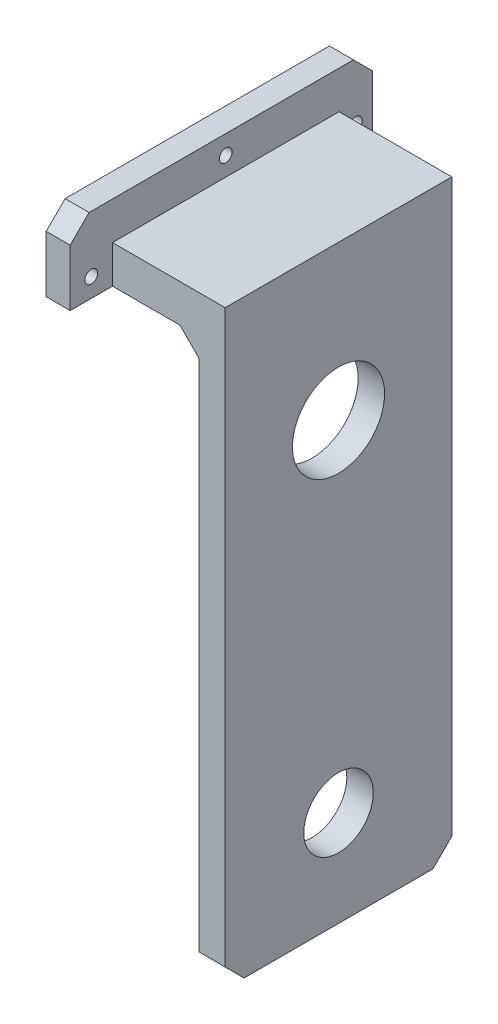
ISO-10303-21;
HEADER;
FILE_DESCRIPTION(('STEP AP214'),'2;1');
FILE_NAME('part.step','',(''),(''),'','','');
FILE_SCHEMA(('AUTOMOTIVE_DESIGN { 1 0 10303 214 1 1 1 1 }'));
ENDSEC;
DATA;
#1=APPLICATION_CONTEXT('core data for automotive mechanical design processes');
#2=APPLICATION_PROTOCOL_DEFINITION('international standard','automotive_design',2000,#1);
#3=PRODUCT_CONTEXT('',#1,'mechanical');
#4=PRODUCT('Part','Part','',(#3));
#5=PRODUCT_RELATED_PRODUCT_CATEGORY('part','',(#4));
#6=PRODUCT_DEFINITION_FORMATION('','',#4);
#7=PRODUCT_DEFINITION_CONTEXT('part definition',#1,'design');
#8=PRODUCT_DEFINITION('design','',#6,#7);
#9=PRODUCT_DEFINITION_SHAPE('','',#8);
#10=(LENGTH_UNIT() NAMED_UNIT(*) SI_UNIT(.MILLI.,.METRE.));
#11=(NAMED_UNIT(*) PLANE_ANGLE_UNIT() SI_UNIT($,.RADIAN.));
#12=(NAMED_UNIT(*) SI_UNIT($,.STERADIAN.) SOLID_ANGLE_UNIT());
#13=UNCERTAINTY_MEASURE_WITH_UNIT(LENGTH_MEASURE(1.E-05),#10,'distance_accuracy_value','');
#14=(GEOMETRIC_REPRESENTATION_CONTEXT(3) GLOBAL_UNCERTAINTY_ASSIGNED_CONTEXT((#13)) GLOBAL_UNIT_ASSIGNED_CONTEXT((#10,
#11,#12)) REPRESENTATION_CONTEXT('',''));
#15=CARTESIAN_POINT('',(0.,0.,0.));
#16=DIRECTION('',(0.,0.,1.));
#17=DIRECTION('',(1.,0.,0.));
#18=AXIS2_PLACEMENT_3D('',#15,#16,#17);
#19=CARTESIAN_POINT('',(18.1,-2.5,15.));
#20=DIRECTION('',(0.,1.,0.));
#21=DIRECTION('',(0.,0.,1.));
#22=AXIS2_PLACEMENT_3D('',#19,#20,#21);
#23=PLANE('',#22);
#24=DIRECTION('',(-1.,0.,0.));
#25=VECTOR('',#24,1.);
#26=CARTESIAN_POINT('',(18.1,-2.5,-15.));
#27=LINE('',#26,#25);
#28=CARTESIAN_POINT('',(12.1,-2.5,-15.));
#29=VERTEX_POINT('',#28);
#30=CARTESIAN_POINT('',(3.175,-2.5,-15.));
#31=VERTEX_POINT('',#30);
#32=EDGE_CURVE('E214',#29,#31,#27,.T.);
#33=ORIENTED_EDGE('',*,*,#32,.F.);
#34=DIRECTION('',(0.,0.,1.));
#35=VECTOR('',#34,1.);
#36=CARTESIAN_POINT('',(12.1,-2.5,15.));
#37=LINE('',#36,#35);
#38=CARTESIAN_POINT('',(12.1,-2.5,15.));
#39=VERTEX_POINT('',#38);
#40=EDGE_CURVE('E223',#29,#39,#37,.T.);
#41=ORIENTED_EDGE('',*,*,#40,.T.);
#42=DIRECTION('',(-1.,0.,0.));
#43=VECTOR('',#42,1.);
#44=CARTESIAN_POINT('',(18.1,-2.5,15.));
#45=LINE('',#44,#43);
#46=CARTESIAN_POINT('',(3.175,-2.5,15.));
#47=VERTEX_POINT('',#46);
#48=EDGE_CURVE('E216',#39,#47,#45,.T.);
#49=ORIENTED_EDGE('',*,*,#48,.T.);
#50=DIRECTION('',(0.,0.,1.));
#51=VECTOR('',#50,1.);
#52=CARTESIAN_POINT('',(3.175,-2.5,-19.402609778092));
#53=LINE('',#52,#51);
#54=CARTESIAN_POINT('',(3.175,-2.5,20.597390221908));
#55=VERTEX_POINT('',#54);
#56=EDGE_CURVE('E162',#47,#55,#53,.T.);
#57=ORIENTED_EDGE('',*,*,#56,.T.);
#58=DIRECTION('',(-1.,0.,0.));
#59=VECTOR('',#58,1.);
#60=CARTESIAN_POINT('',(3.175,-2.5,20.597390221908));
#61=LINE('',#60,#59);
#62=CARTESIAN_POINT('',(0.,-2.5,20.597390221908));
#63=VERTEX_POINT('',#62);
#64=EDGE_CURVE('E172',#55,#63,#61,.T.);
#65=ORIENTED_EDGE('',*,*,#64,.T.);
#66=DIRECTION('',(0.,0.,-1.));
#67=VECTOR('',#66,1.);
#68=CARTESIAN_POINT('',(0.,-2.5,15.));
#69=LINE('',#68,#67);
#70=CARTESIAN_POINT('',(0.,-2.5,-19.402609778092));
#71=VERTEX_POINT('',#70);
#72=EDGE_CURVE('E171',#63,#71,#69,.T.);
#73=ORIENTED_EDGE('',*,*,#72,.T.);
#74=DIRECTION('',(-1.,0.,0.));
#75=VECTOR('',#74,1.);
#76=CARTESIAN_POINT('',(3.175,-2.5,-19.402609778092));
#77=LINE('',#76,#75);
#78=CARTESIAN_POINT('',(3.175,-2.5,-19.402609778092));
#79=VERTEX_POINT('',#78);
#80=EDGE_CURVE('E156',#79,#71,#77,.T.);
#81=ORIENTED_EDGE('',*,*,#80,.F.);
#82=EDGE_CURVE('E169',#79,#31,#53,.T.);
#83=ORIENTED_EDGE('',*,*,#82,.T.);
#84=EDGE_LOOP('',(#33,#41,#49,#57,#65,#73,#81,#83));
#85=FACE_BOUND('',#84,.T.);
#86=ADVANCED_FACE('F44',(#85),#23,.F.);
#87=CARTESIAN_POINT('',(18.1,2.5,15.));
#88=DIRECTION('',(0.,0.,-1.));
#89=DIRECTION('',(-1.,0.,0.));
#90=AXIS2_PLACEMENT_3D('',#87,#88,#89);
#91=PLANE('',#90);
#92=DIRECTION('',(0.,1.,0.));
#93=VECTOR('',#92,1.);
#94=CARTESIAN_POINT('',(14.6,-75.6,15.));
#95=LINE('',#94,#93);
#96=CARTESIAN_POINT('',(14.6,-73.1,15.));
#97=VERTEX_POINT('',#96);
#98=CARTESIAN_POINT('',(14.6,-5.,15.));
#99=VERTEX_POINT('',#98);
#100=EDGE_CURVE('E287',#97,#99,#95,.T.);
#101=ORIENTED_EDGE('',*,*,#100,.F.);
#102=DIRECTION('',(1.,0.,0.));
#103=VECTOR('',#102,1.);
#104=CARTESIAN_POINT('',(18.1,-73.1,15.));
#105=LINE('',#104,#103);
#106=CARTESIAN_POINT('',(18.1,-73.1,15.));
#107=VERTEX_POINT('',#106);
#108=EDGE_CURVE('E11',#97,#107,#105,.T.);
#109=ORIENTED_EDGE('',*,*,#108,.T.);
#110=DIRECTION('',(0.,-1.,0.));
#111=VECTOR('',#110,1.);
#112=CARTESIAN_POINT('',(18.1,2.5,15.));
#113=LINE('',#112,#111);
#114=CARTESIAN_POINT('',(18.1,2.5,15.));
#115=VERTEX_POINT('',#114);
#116=EDGE_CURVE('E200',#115,#107,#113,.T.);
#117=ORIENTED_EDGE('',*,*,#116,.F.);
#118=DIRECTION('',(-1.,0.,0.));
#119=VECTOR('',#118,1.);
#120=CARTESIAN_POINT('',(18.1,2.5,15.));
#121=LINE('',#120,#119);
#122=CARTESIAN_POINT('',(3.175,2.5,15.));
#123=VERTEX_POINT('',#122);
#124=EDGE_CURVE('E207',#115,#123,#121,.T.);
#125=ORIENTED_EDGE('',*,*,#124,.T.);
#126=DIRECTION('',(0.,1.,0.));
#127=VECTOR('',#126,1.);
#128=CARTESIAN_POINT('',(3.175,2.5,15.));
#129=LINE('',#128,#127);
#130=EDGE_CURVE('E197',#47,#123,#129,.T.);
#131=ORIENTED_EDGE('',*,*,#130,.F.);
#132=ORIENTED_EDGE('',*,*,#48,.F.);
#133=DIRECTION('',(-0.707106781186545,0.70710678118655,0.));
#134=VECTOR('',#133,1.);
#135=CARTESIAN_POINT('',(12.6,-2.99999999999998,15.));
#136=LINE('',#135,#134);
#137=EDGE_CURVE('E227',#39,#99,#136,.F.);
#138=ORIENTED_EDGE('',*,*,#137,.T.);
#139=EDGE_LOOP('',(#101,#109,#117,#125,#131,#132,#138));
#140=FACE_BOUND('',#139,.T.);
#141=ADVANCED_FACE('F286',(#140),#91,.F.);
#142=CARTESIAN_POINT('',(18.1,2.5,-15.));
#143=DIRECTION('',(0.,0.,1.));
#144=DIRECTION('',(1.,0.,0.));
#145=AXIS2_PLACEMENT_3D('',#142,#143,#144);
#146=PLANE('',#145);
#147=DIRECTION('',(0.,1.,0.));
#148=VECTOR('',#147,1.);
#149=CARTESIAN_POINT('',(18.1,2.5,-15.));
#150=LINE('',#149,#148);
#151=CARTESIAN_POINT('',(18.1,-73.1,-15.));
#152=VERTEX_POINT('',#151);
#153=CARTESIAN_POINT('',(18.1,2.5,-15.));
#154=VERTEX_POINT('',#153);
#155=EDGE_CURVE('E203',#152,#154,#150,.T.);
#156=ORIENTED_EDGE('',*,*,#155,.F.);
#157=DIRECTION('',(-1.,0.,0.));
#158=VECTOR('',#157,1.);
#159=CARTESIAN_POINT('',(18.1,-73.1,-15.));
#160=LINE('',#159,#158);
#161=CARTESIAN_POINT('',(14.6,-73.1,-15.));
#162=VERTEX_POINT('',#161);
#163=EDGE_CURVE('E68',#152,#162,#160,.T.);
#164=ORIENTED_EDGE('',*,*,#163,.T.);
#165=DIRECTION('',(0.,1.,0.));
#166=VECTOR('',#165,1.);
#167=CARTESIAN_POINT('',(14.6,-75.6,-15.));
#168=LINE('',#167,#166);
#169=CARTESIAN_POINT('',(14.6,-5.,-15.));
#170=VERTEX_POINT('',#169);
#171=EDGE_CURVE('E262',#162,#170,#168,.T.);
#172=ORIENTED_EDGE('',*,*,#171,.T.);
#173=DIRECTION('',(0.707106781186545,-0.70710678118655,0.));
#174=VECTOR('',#173,1.);
#175=CARTESIAN_POINT('',(12.6,-2.99999999999998,-15.));
#176=LINE('',#175,#174);
#177=EDGE_CURVE('E225',#170,#29,#176,.F.);
#178=ORIENTED_EDGE('',*,*,#177,.T.);
#179=ORIENTED_EDGE('',*,*,#32,.T.);
#180=DIRECTION('',(0.,-1.,0.));
#181=VECTOR('',#180,1.);
#182=CARTESIAN_POINT('',(3.175,2.5,-15.));
#183=LINE('',#182,#181);
#184=CARTESIAN_POINT('',(3.175,2.5,-15.));
#185=VERTEX_POINT('',#184);
#186=EDGE_CURVE('E178',#185,#31,#183,.T.);
#187=ORIENTED_EDGE('',*,*,#186,.F.);
#188=DIRECTION('',(-1.,0.,0.));
#189=VECTOR('',#188,1.);
#190=CARTESIAN_POINT('',(18.1,2.5,-15.));
#191=LINE('',#190,#189);
#192=EDGE_CURVE('E211',#154,#185,#191,.T.);
#193=ORIENTED_EDGE('',*,*,#192,.F.);
#194=EDGE_LOOP('',(#156,#164,#172,#178,#179,#187,#193));
#195=FACE_BOUND('',#194,.T.);
#196=ADVANCED_FACE('F276',(#195),#146,.F.);
#197=CARTESIAN_POINT('',(18.1,2.5,15.));
#198=DIRECTION('',(0.,-1.,0.));
#199=DIRECTION('',(0.,0.,-1.));
#200=AXIS2_PLACEMENT_3D('',#197,#198,#199);
#201=PLANE('',#200);
#202=DIRECTION('',(0.,0.,-1.));
#203=VECTOR('',#202,1.);
#204=CARTESIAN_POINT('',(3.175,2.5,15.));
#205=LINE('',#204,#203);
#206=EDGE_CURVE('E218',#123,#185,#205,.T.);
#207=ORIENTED_EDGE('',*,*,#206,.F.);
#208=ORIENTED_EDGE('',*,*,#124,.F.);
#209=DIRECTION('',(0.,0.,1.));
#210=VECTOR('',#209,1.);
#211=CARTESIAN_POINT('',(18.1,2.5,15.));
#212=LINE('',#211,#210);
#213=EDGE_CURVE('E205',#154,#115,#212,.T.);
#214=ORIENTED_EDGE('',*,*,#213,.F.);
#215=ORIENTED_EDGE('',*,*,#192,.T.);
#216=EDGE_LOOP('',(#207,#208,#214,#215));
#217=FACE_BOUND('',#216,.T.);
#218=ADVANCED_FACE('F280',(#217),#201,.F.);
#219=CARTESIAN_POINT('',(18.1,0.,0.));
#220=DIRECTION('',(1.,0.,0.));
#221=DIRECTION('',(0.,0.,-1.));
#222=AXIS2_PLACEMENT_3D('',#219,#220,#221);
#223=PLANE('',#222);
#224=CARTESIAN_POINT('',(18.1,-17.9000000000868,-2.03531101694576E-06));
#225=DIRECTION('',(1.,0.,0.));
#226=DIRECTION('',(0.,0.,-1.));
#227=AXIS2_PLACEMENT_3D('',#224,#225,#226);
#228=CIRCLE('',#227,6.1);
#229=CARTESIAN_POINT('',(18.1,-17.9000000000868,-6.10000203531102));
#230=VERTEX_POINT('',#229);
#231=EDGE_CURVE('E566',#230,#230,#228,.T.);
#232=ORIENTED_EDGE('',*,*,#231,.F.);
#233=EDGE_LOOP('',(#232));
#234=FACE_BOUND('',#233,.T.);
#235=CARTESIAN_POINT('',(18.1,-62.9000000000129,-5.14422879294152E-09));
#236=DIRECTION('',(1.,0.,0.));
#237=DIRECTION('',(0.,0.,-1.));
#238=AXIS2_PLACEMENT_3D('',#235,#236,#237);
#239=CIRCLE('',#238,4.6);
#240=CARTESIAN_POINT('',(18.1,-62.9000000000129,-4.60000000514423));
#241=VERTEX_POINT('',#240);
#242=EDGE_CURVE('E569',#241,#241,#239,.T.);
#243=ORIENTED_EDGE('',*,*,#242,.F.);
#244=EDGE_LOOP('',(#243));
#245=FACE_BOUND('',#244,.T.);
#246=DIRECTION('',(0.,0.,1.));
#247=VECTOR('',#246,1.);
#248=CARTESIAN_POINT('',(18.1,-75.6,15.));
#249=LINE('',#248,#247);
#250=CARTESIAN_POINT('',(18.1,-75.6,-12.5));
#251=VERTEX_POINT('',#250);
#252=CARTESIAN_POINT('',(18.1,-75.6,12.5));
#253=VERTEX_POINT('',#252);
#254=EDGE_CURVE('E270',#251,#253,#249,.T.);
#255=ORIENTED_EDGE('',*,*,#254,.F.);
#256=DIRECTION('',(0.,-0.707106781186548,0.707106781186548));
#257=VECTOR('',#256,1.);
#258=CARTESIAN_POINT('',(18.1,-44.05,-44.05));
#259=LINE('',#258,#257);
#260=EDGE_CURVE('E255',#251,#152,#259,.F.);
#261=ORIENTED_EDGE('',*,*,#260,.T.);
#262=ORIENTED_EDGE('',*,*,#155,.T.);
#263=ORIENTED_EDGE('',*,*,#213,.T.);
#264=ORIENTED_EDGE('',*,*,#116,.T.);
#265=DIRECTION('',(0.,0.707106781186548,0.707106781186548));
#266=VECTOR('',#265,1.);
#267=CARTESIAN_POINT('',(18.1,-44.05,44.05));
#268=LINE('',#267,#266);
#269=EDGE_CURVE('E253',#107,#253,#268,.F.);
#270=ORIENTED_EDGE('',*,*,#269,.T.);
#271=EDGE_LOOP('',(#255,#261,#262,#263,#264,#270));
#272=FACE_BOUND('',#271,.T.);
#273=ADVANCED_FACE('F274',(#234,#245,#272),#223,.T.);
#274=CARTESIAN_POINT('',(0.,0.,0.));
#275=DIRECTION('',(1.,0.,0.));
#276=DIRECTION('',(0.,0.,-1.));
#277=AXIS2_PLACEMENT_3D('',#274,#275,#276);
#278=PLANE('',#277);
#279=DIRECTION('',(0.,0.,-1.));
#280=VECTOR('',#279,1.);
#281=CARTESIAN_POINT('',(0.,7.5,-19.402609778092));
#282=LINE('',#281,#280);
#283=CARTESIAN_POINT('',(0.,7.5,18.097390221908));
#284=VERTEX_POINT('',#283);
#285=CARTESIAN_POINT('',(0.,7.5,-16.902609778092));
#286=VERTEX_POINT('',#285);
#287=EDGE_CURVE('E163',#284,#286,#282,.T.);
#288=ORIENTED_EDGE('',*,*,#287,.T.);
#289=DIRECTION('',(0.,0.707106781186549,0.707106781186546));
#290=VECTOR('',#289,1.);
#291=CARTESIAN_POINT('',(0.,7.5,-16.902609778092));
#292=LINE('',#291,#290);
#293=CARTESIAN_POINT('',(0.,4.99999999999998,-19.402609778092));
#294=VERTEX_POINT('',#293);
#295=EDGE_CURVE('E237',#286,#294,#292,.F.);
#296=ORIENTED_EDGE('',*,*,#295,.T.);
#297=DIRECTION('',(0.,-1.,0.));
#298=VECTOR('',#297,1.);
#299=CARTESIAN_POINT('',(0.,7.5,-19.402609778092));
#300=LINE('',#299,#298);
#301=EDGE_CURVE('E187',#294,#71,#300,.T.);
#302=ORIENTED_EDGE('',*,*,#301,.T.);
#303=ORIENTED_EDGE('',*,*,#72,.F.);
#304=DIRECTION('',(0.,1.,0.));
#305=VECTOR('',#304,1.);
#306=CARTESIAN_POINT('',(0.,-2.5,20.597390221908));
#307=LINE('',#306,#305);
#308=CARTESIAN_POINT('',(0.,5.00000000000001,20.597390221908));
#309=VERTEX_POINT('',#308);
#310=EDGE_CURVE('E189',#63,#309,#307,.T.);
#311=ORIENTED_EDGE('',*,*,#310,.T.);
#312=DIRECTION('',(0.,-0.707106781186548,0.707106781186548));
#313=VECTOR('',#312,1.);
#314=CARTESIAN_POINT('',(0.,5.00000000000001,20.597390221908));
#315=LINE('',#314,#313);
#316=EDGE_CURVE('E235',#309,#284,#315,.F.);
#317=ORIENTED_EDGE('',*,*,#316,.T.);
#318=EDGE_LOOP('',(#288,#296,#302,#303,#311,#317));
#319=FACE_BOUND('',#318,.T.);
#320=CARTESIAN_POINT('',(0.,5.,0.));
#321=DIRECTION('',(-1.,0.,0.));
#322=DIRECTION('',(0.,0.,1.));
#323=AXIS2_PLACEMENT_3D('',#320,#321,#322);
#324=CIRCLE('',#323,0.85);
#325=CARTESIAN_POINT('',(0.,5.,0.85));
#326=VERTEX_POINT('',#325);
#327=EDGE_CURVE('E304',#326,#326,#324,.T.);
#328=ORIENTED_EDGE('',*,*,#327,.F.);
#329=EDGE_LOOP('',(#328));
#330=FACE_BOUND('',#329,.T.);
#331=CARTESIAN_POINT('',(0.,0.,-17.201304889046));
#332=DIRECTION('',(-1.,0.,0.));
#333=DIRECTION('',(0.,0.,1.));
#334=AXIS2_PLACEMENT_3D('',#331,#332,#333);
#335=CIRCLE('',#334,0.85);
#336=CARTESIAN_POINT('',(0.,0.,-16.351304889046));
#337=VERTEX_POINT('',#336);
#338=EDGE_CURVE('E299',#337,#337,#335,.T.);
#339=ORIENTED_EDGE('',*,*,#338,.F.);
#340=EDGE_LOOP('',(#339));
#341=FACE_BOUND('',#340,.T.);
#342=CARTESIAN_POINT('',(0.,0.,17.798695110954));
#343=DIRECTION('',(-1.,0.,0.));
#344=DIRECTION('',(0.,0.,1.));
#345=AXIS2_PLACEMENT_3D('',#342,#343,#344);
#346=CIRCLE('',#345,0.85);
#347=CARTESIAN_POINT('',(0.,0.,18.648695110954));
#348=VERTEX_POINT('',#347);
#349=EDGE_CURVE('E291',#348,#348,#346,.T.);
#350=ORIENTED_EDGE('',*,*,#349,.F.);
#351=EDGE_LOOP('',(#350));
#352=FACE_BOUND('',#351,.T.);
#353=ADVANCED_FACE('F313',(#319,#330,#341,#352),#278,.F.);
#354=CARTESIAN_POINT('',(3.175,0.,0.));
#355=DIRECTION('',(-1.,0.,0.));
#356=DIRECTION('',(0.,0.,1.));
#357=AXIS2_PLACEMENT_3D('',#354,#355,#356);
#358=PLANE('',#357);
#359=CARTESIAN_POINT('',(3.175,0.,17.798695110954));
#360=DIRECTION('',(-1.,0.,0.));
#361=DIRECTION('',(0.,0.,1.));
#362=AXIS2_PLACEMENT_3D('',#359,#360,#361);
#363=CIRCLE('',#362,0.85);
#364=CARTESIAN_POINT('',(3.175,0.,18.648695110954));
#365=VERTEX_POINT('',#364);
#366=EDGE_CURVE('E294',#365,#365,#363,.T.);
#367=ORIENTED_EDGE('',*,*,#366,.T.);
#368=EDGE_LOOP('',(#367));
#369=FACE_BOUND('',#368,.T.);
#370=CARTESIAN_POINT('',(3.175,0.,-17.201304889046));
#371=DIRECTION('',(-1.,0.,0.));
#372=DIRECTION('',(0.,0.,1.));
#373=AXIS2_PLACEMENT_3D('',#370,#371,#372);
#374=CIRCLE('',#373,0.85);
#375=CARTESIAN_POINT('',(3.175,0.,-16.351304889046));
#376=VERTEX_POINT('',#375);
#377=EDGE_CURVE('E301',#376,#376,#374,.T.);
#378=ORIENTED_EDGE('',*,*,#377,.T.);
#379=EDGE_LOOP('',(#378));
#380=FACE_BOUND('',#379,.T.);
#381=CARTESIAN_POINT('',(3.175,5.,0.));
#382=DIRECTION('',(-1.,0.,0.));
#383=DIRECTION('',(0.,0.,1.));
#384=AXIS2_PLACEMENT_3D('',#381,#382,#383);
#385=CIRCLE('',#384,0.85);
#386=CARTESIAN_POINT('',(3.175,5.,0.85));
#387=VERTEX_POINT('',#386);
#388=EDGE_CURVE('E190',#387,#387,#385,.T.);
#389=ORIENTED_EDGE('',*,*,#388,.T.);
#390=EDGE_LOOP('',(#389));
#391=FACE_BOUND('',#390,.T.);
#392=DIRECTION('',(0.,-1.,0.));
#393=VECTOR('',#392,1.);
#394=CARTESIAN_POINT('',(3.175,7.5,-19.402609778092));
#395=LINE('',#394,#393);
#396=CARTESIAN_POINT('',(3.175,4.99999999999998,-19.402609778092));
#397=VERTEX_POINT('',#396);
#398=EDGE_CURVE('E152',#397,#79,#395,.T.);
#399=ORIENTED_EDGE('',*,*,#398,.F.);
#400=DIRECTION('',(0.,-0.707106781186549,-0.707106781186546));
#401=VECTOR('',#400,1.);
#402=CARTESIAN_POINT('',(3.175,7.5,-16.902609778092));
#403=LINE('',#402,#401);
#404=CARTESIAN_POINT('',(3.175,7.5,-16.902609778092));
#405=VERTEX_POINT('',#404);
#406=EDGE_CURVE('E242',#397,#405,#403,.F.);
#407=ORIENTED_EDGE('',*,*,#406,.T.);
#408=DIRECTION('',(0.,0.,-1.));
#409=VECTOR('',#408,1.);
#410=CARTESIAN_POINT('',(3.175,7.5,-19.402609778092));
#411=LINE('',#410,#409);
#412=CARTESIAN_POINT('',(3.175,7.5,18.097390221908));
#413=VERTEX_POINT('',#412);
#414=EDGE_CURVE('E173',#413,#405,#411,.T.);
#415=ORIENTED_EDGE('',*,*,#414,.F.);
#416=DIRECTION('',(0.,0.707106781186548,-0.707106781186548));
#417=VECTOR('',#416,1.);
#418=CARTESIAN_POINT('',(3.175,5.00000000000001,20.597390221908));
#419=LINE('',#418,#417);
#420=CARTESIAN_POINT('',(3.175,5.00000000000001,20.597390221908));
#421=VERTEX_POINT('',#420);
#422=EDGE_CURVE('E240',#413,#421,#419,.F.);
#423=ORIENTED_EDGE('',*,*,#422,.T.);
#424=DIRECTION('',(0.,1.,0.));
#425=VECTOR('',#424,1.);
#426=CARTESIAN_POINT('',(3.175,-2.5,20.597390221908));
#427=LINE('',#426,#425);
#428=EDGE_CURVE('E179',#55,#421,#427,.T.);
#429=ORIENTED_EDGE('',*,*,#428,.F.);
#430=ORIENTED_EDGE('',*,*,#56,.F.);
#431=ORIENTED_EDGE('',*,*,#130,.T.);
#432=ORIENTED_EDGE('',*,*,#206,.T.);
#433=ORIENTED_EDGE('',*,*,#186,.T.);
#434=ORIENTED_EDGE('',*,*,#82,.F.);
#435=EDGE_LOOP('',(#399,#407,#415,#423,#429,#430,#431,#432,#433,#434));
#436=FACE_BOUND('',#435,.T.);
#437=ADVANCED_FACE('F176',(#369,#380,#391,#436),#358,.F.);
#438=CARTESIAN_POINT('',(3.175,7.5,-19.402609778092));
#439=DIRECTION('',(0.,0.,-1.));
#440=DIRECTION('',(-1.,0.,0.));
#441=AXIS2_PLACEMENT_3D('',#438,#439,#440);
#442=PLANE('',#441);
#443=ORIENTED_EDGE('',*,*,#301,.F.);
#444=DIRECTION('',(1.,0.,0.));
#445=VECTOR('',#444,1.);
#446=CARTESIAN_POINT('',(3.175,4.99999999999998,-19.402609778092));
#447=LINE('',#446,#445);
#448=EDGE_CURVE('E158',#294,#397,#447,.T.);
#449=ORIENTED_EDGE('',*,*,#448,.T.);
#450=ORIENTED_EDGE('',*,*,#398,.T.);
#451=ORIENTED_EDGE('',*,*,#80,.T.);
#452=EDGE_LOOP('',(#443,#449,#450,#451));
#453=FACE_BOUND('',#452,.T.);
#454=ADVANCED_FACE('F155',(#453),#442,.T.);
#455=CARTESIAN_POINT('',(3.175,7.5,-19.402609778092));
#456=DIRECTION('',(0.,1.,0.));
#457=DIRECTION('',(0.,0.,1.));
#458=AXIS2_PLACEMENT_3D('',#455,#456,#457);
#459=PLANE('',#458);
#460=ORIENTED_EDGE('',*,*,#414,.T.);
#461=DIRECTION('',(-1.,0.,0.));
#462=VECTOR('',#461,1.);
#463=CARTESIAN_POINT('',(3.175,7.5,-16.902609778092));
#464=LINE('',#463,#462);
#465=EDGE_CURVE('E232',#405,#286,#464,.T.);
#466=ORIENTED_EDGE('',*,*,#465,.T.);
#467=ORIENTED_EDGE('',*,*,#287,.F.);
#468=DIRECTION('',(1.,0.,0.));
#469=VECTOR('',#468,1.);
#470=CARTESIAN_POINT('',(3.175,7.5,18.097390221908));
#471=LINE('',#470,#469);
#472=EDGE_CURVE('E230',#284,#413,#471,.T.);
#473=ORIENTED_EDGE('',*,*,#472,.T.);
#474=EDGE_LOOP('',(#460,#466,#467,#473));
#475=FACE_BOUND('',#474,.T.);
#476=ADVANCED_FACE('F472',(#475),#459,.T.);
#477=CARTESIAN_POINT('',(3.175,-2.5,20.597390221908));
#478=DIRECTION('',(0.,0.,1.));
#479=DIRECTION('',(1.,0.,0.));
#480=AXIS2_PLACEMENT_3D('',#477,#478,#479);
#481=PLANE('',#480);
#482=ORIENTED_EDGE('',*,*,#428,.T.);
#483=DIRECTION('',(-1.,0.,0.));
#484=VECTOR('',#483,1.);
#485=CARTESIAN_POINT('',(3.175,5.00000000000001,20.597390221908));
#486=LINE('',#485,#484);
#487=EDGE_CURVE('E244',#421,#309,#486,.T.);
#488=ORIENTED_EDGE('',*,*,#487,.T.);
#489=ORIENTED_EDGE('',*,*,#310,.F.);
#490=ORIENTED_EDGE('',*,*,#64,.F.);
#491=EDGE_LOOP('',(#482,#488,#489,#490));
#492=FACE_BOUND('',#491,.T.);
#493=ADVANCED_FACE('F468',(#492),#481,.T.);
#494=CARTESIAN_POINT('',(3.175,5.,0.));
#495=DIRECTION('',(-1.,0.,0.));
#496=DIRECTION('',(0.,0.,1.));
#497=AXIS2_PLACEMENT_3D('',#494,#495,#496);
#498=CYLINDRICAL_SURFACE('',#497,0.85);
#499=ORIENTED_EDGE('',*,*,#388,.F.);
#500=EDGE_LOOP('',(#499));
#501=FACE_BOUND('',#500,.T.);
#502=ORIENTED_EDGE('',*,*,#327,.T.);
#503=EDGE_LOOP('',(#502));
#504=FACE_BOUND('',#503,.T.);
#505=ADVANCED_FACE('F311',(#501,#504),#498,.F.);
#506=CARTESIAN_POINT('',(3.175,0.,-17.201304889046));
#507=DIRECTION('',(-1.,0.,0.));
#508=DIRECTION('',(0.,0.,1.));
#509=AXIS2_PLACEMENT_3D('',#506,#507,#508);
#510=CYLINDRICAL_SURFACE('',#509,0.85);
#511=ORIENTED_EDGE('',*,*,#377,.F.);
#512=EDGE_LOOP('',(#511));
#513=FACE_BOUND('',#512,.T.);
#514=ORIENTED_EDGE('',*,*,#338,.T.);
#515=EDGE_LOOP('',(#514));
#516=FACE_BOUND('',#515,.T.);
#517=ADVANCED_FACE('F324',(#513,#516),#510,.F.);
#518=CARTESIAN_POINT('',(3.175,0.,17.798695110954));
#519=DIRECTION('',(-1.,0.,0.));
#520=DIRECTION('',(0.,0.,1.));
#521=AXIS2_PLACEMENT_3D('',#518,#519,#520);
#522=CYLINDRICAL_SURFACE('',#521,0.85);
#523=ORIENTED_EDGE('',*,*,#366,.F.);
#524=EDGE_LOOP('',(#523));
#525=FACE_BOUND('',#524,.T.);
#526=ORIENTED_EDGE('',*,*,#349,.T.);
#527=EDGE_LOOP('',(#526));
#528=FACE_BOUND('',#527,.T.);
#529=ADVANCED_FACE('F322',(#525,#528),#522,.F.);
#530=CARTESIAN_POINT('',(14.6,-75.6,15.));
#531=DIRECTION('',(1.,0.,0.));
#532=DIRECTION('',(0.,0.,-1.));
#533=AXIS2_PLACEMENT_3D('',#530,#531,#532);
#534=PLANE('',#533);
#535=CARTESIAN_POINT('',(14.6,-17.9000000000868,-2.03531101694576E-06));
#536=DIRECTION('',(1.,0.,0.));
#537=DIRECTION('',(0.,0.,-1.));
#538=AXIS2_PLACEMENT_3D('',#535,#536,#537);
#539=CIRCLE('',#538,6.1);
#540=CARTESIAN_POINT('',(14.6,-17.9000000000868,-6.10000203531102));
#541=VERTEX_POINT('',#540);
#542=EDGE_CURVE('E572',#541,#541,#539,.F.);
#543=ORIENTED_EDGE('',*,*,#542,.F.);
#544=EDGE_LOOP('',(#543));
#545=FACE_BOUND('',#544,.T.);
#546=CARTESIAN_POINT('',(14.6,-62.9000000000129,-5.14422879294152E-09));
#547=DIRECTION('',(1.,0.,0.));
#548=DIRECTION('',(0.,0.,-1.));
#549=AXIS2_PLACEMENT_3D('',#546,#547,#548);
#550=CIRCLE('',#549,4.6);
#551=CARTESIAN_POINT('',(14.6,-62.9000000000129,-4.60000000514423));
#552=VERTEX_POINT('',#551);
#553=EDGE_CURVE('E570',#552,#552,#550,.F.);
#554=ORIENTED_EDGE('',*,*,#553,.F.);
#555=EDGE_LOOP('',(#554));
#556=FACE_BOUND('',#555,.T.);
#557=ORIENTED_EDGE('',*,*,#171,.F.);
#558=DIRECTION('',(0.,0.707106781186548,-0.707106781186548));
#559=VECTOR('',#558,1.);
#560=CARTESIAN_POINT('',(14.6,-75.6,-12.5));
#561=LINE('',#560,#559);
#562=CARTESIAN_POINT('',(14.6,-75.6,-12.5));
#563=VERTEX_POINT('',#562);
#564=EDGE_CURVE('E53',#162,#563,#561,.F.);
#565=ORIENTED_EDGE('',*,*,#564,.T.);
#566=DIRECTION('',(0.,0.,-1.));
#567=VECTOR('',#566,1.);
#568=CARTESIAN_POINT('',(14.6,-75.6,15.));
#569=LINE('',#568,#567);
#570=CARTESIAN_POINT('',(14.6,-75.6,12.5));
#571=VERTEX_POINT('',#570);
#572=EDGE_CURVE('E261',#571,#563,#569,.T.);
#573=ORIENTED_EDGE('',*,*,#572,.F.);
#574=DIRECTION('',(0.,-0.707106781186548,-0.707106781186548));
#575=VECTOR('',#574,1.);
#576=CARTESIAN_POINT('',(14.6,-75.6,12.5));
#577=LINE('',#576,#575);
#578=EDGE_CURVE('E60',#571,#97,#577,.F.);
#579=ORIENTED_EDGE('',*,*,#578,.T.);
#580=ORIENTED_EDGE('',*,*,#100,.T.);
#581=DIRECTION('',(0.,0.,-1.));
#582=VECTOR('',#581,1.);
#583=CARTESIAN_POINT('',(14.6,-5.,-15.));
#584=LINE('',#583,#582);
#585=EDGE_CURVE('E220',#99,#170,#584,.T.);
#586=ORIENTED_EDGE('',*,*,#585,.T.);
#587=EDGE_LOOP('',(#557,#565,#573,#579,#580,#586));
#588=FACE_BOUND('',#587,.T.);
#589=ADVANCED_FACE('F260',(#545,#556,#588),#534,.F.);
#590=CARTESIAN_POINT('',(0.,-75.6,0.));
#591=DIRECTION('',(0.,1.,0.));
#592=DIRECTION('',(0.,0.,1.));
#593=AXIS2_PLACEMENT_3D('',#590,#591,#592);
#594=PLANE('',#593);
#595=ORIENTED_EDGE('',*,*,#572,.T.);
#596=DIRECTION('',(1.,0.,0.));
#597=VECTOR('',#596,1.);
#598=CARTESIAN_POINT('',(0.,-75.6,-12.5));
#599=LINE('',#598,#597);
#600=EDGE_CURVE('E250',#563,#251,#599,.T.);
#601=ORIENTED_EDGE('',*,*,#600,.T.);
#602=ORIENTED_EDGE('',*,*,#254,.T.);
#603=DIRECTION('',(-1.,0.,0.));
#604=VECTOR('',#603,1.);
#605=CARTESIAN_POINT('',(0.,-75.6,12.5));
#606=LINE('',#605,#604);
#607=EDGE_CURVE('E247',#253,#571,#606,.T.);
#608=ORIENTED_EDGE('',*,*,#607,.T.);
#609=EDGE_LOOP('',(#595,#601,#602,#608));
#610=FACE_BOUND('',#609,.T.);
#611=ADVANCED_FACE('F266',(#610),#594,.F.);
#612=CARTESIAN_POINT('',(14.6,-5.,15.));
#613=DIRECTION('',(-0.70710678118655,-0.707106781186545,0.));
#614=DIRECTION('',(0.,0.,1.));
#615=AXIS2_PLACEMENT_3D('',#612,#613,#614);
#616=PLANE('',#615);
#617=ORIENTED_EDGE('',*,*,#137,.F.);
#618=ORIENTED_EDGE('',*,*,#40,.F.);
#619=ORIENTED_EDGE('',*,*,#177,.F.);
#620=ORIENTED_EDGE('',*,*,#585,.F.);
#621=EDGE_LOOP('',(#617,#618,#619,#620));
#622=FACE_BOUND('',#621,.T.);
#623=ADVANCED_FACE('F347',(#622),#616,.T.);
#624=CARTESIAN_POINT('',(3.175,7.5,-16.902609778092));
#625=DIRECTION('',(0.,-0.707106781186545,0.707106781186549));
#626=DIRECTION('',(-1.,0.,0.));
#627=AXIS2_PLACEMENT_3D('',#624,#625,#626);
#628=PLANE('',#627);
#629=ORIENTED_EDGE('',*,*,#406,.F.);
#630=ORIENTED_EDGE('',*,*,#448,.F.);
#631=ORIENTED_EDGE('',*,*,#295,.F.);
#632=ORIENTED_EDGE('',*,*,#465,.F.);
#633=EDGE_LOOP('',(#629,#630,#631,#632));
#634=FACE_BOUND('',#633,.T.);
#635=ADVANCED_FACE('F352',(#634),#628,.F.);
#636=CARTESIAN_POINT('',(3.175,5.00000000000001,20.597390221908));
#637=DIRECTION('',(0.,-0.707106781186548,-0.707106781186548));
#638=DIRECTION('',(-1.,0.,0.));
#639=AXIS2_PLACEMENT_3D('',#636,#637,#638);
#640=PLANE('',#639);
#641=ORIENTED_EDGE('',*,*,#422,.F.);
#642=ORIENTED_EDGE('',*,*,#472,.F.);
#643=ORIENTED_EDGE('',*,*,#316,.F.);
#644=ORIENTED_EDGE('',*,*,#487,.F.);
#645=EDGE_LOOP('',(#641,#642,#643,#644));
#646=FACE_BOUND('',#645,.T.);
#647=ADVANCED_FACE('F359',(#646),#640,.F.);
#648=CARTESIAN_POINT('',(-0.001000000000001,-62.9000000000129,-5.14422879294152E-09));
#649=DIRECTION('',(1.,0.,0.));
#650=DIRECTION('',(0.,0.,-1.));
#651=AXIS2_PLACEMENT_3D('',#648,#649,#650);
#652=CYLINDRICAL_SURFACE('',#651,4.6);
#653=ORIENTED_EDGE('',*,*,#242,.T.);
#654=EDGE_LOOP('',(#653));
#655=FACE_BOUND('',#654,.T.);
#656=ORIENTED_EDGE('',*,*,#553,.T.);
#657=EDGE_LOOP('',(#656));
#658=FACE_BOUND('',#657,.T.);
#659=ADVANCED_FACE('F365',(#655,#658),#652,.F.);
#660=CARTESIAN_POINT('',(-0.001000000000001,-17.9000000000868,-2.03531101694576E-06));
#661=DIRECTION('',(1.,0.,0.));
#662=DIRECTION('',(0.,0.,-1.));
#663=AXIS2_PLACEMENT_3D('',#660,#661,#662);
#664=CYLINDRICAL_SURFACE('',#663,6.1);
#665=ORIENTED_EDGE('',*,*,#231,.T.);
#666=EDGE_LOOP('',(#665));
#667=FACE_BOUND('',#666,.T.);
#668=ORIENTED_EDGE('',*,*,#542,.T.);
#669=EDGE_LOOP('',(#668));
#670=FACE_BOUND('',#669,.T.);
#671=ADVANCED_FACE('F370',(#667,#670),#664,.F.);
#672=CARTESIAN_POINT('',(0.,-75.6,-12.5));
#673=DIRECTION('',(0.,0.707106781186547,0.707106781186547));
#674=DIRECTION('',(1.,0.,0.));
#675=AXIS2_PLACEMENT_3D('',#672,#673,#674);
#676=PLANE('',#675);
#677=ORIENTED_EDGE('',*,*,#564,.F.);
#678=ORIENTED_EDGE('',*,*,#163,.F.);
#679=ORIENTED_EDGE('',*,*,#260,.F.);
#680=ORIENTED_EDGE('',*,*,#600,.F.);
#681=EDGE_LOOP('',(#677,#678,#679,#680));
#682=FACE_BOUND('',#681,.T.);
#683=ADVANCED_FACE('F272',(#682),#676,.F.);
#684=CARTESIAN_POINT('',(0.,-75.6,12.5));
#685=DIRECTION('',(0.,0.707106781186547,-0.707106781186547));
#686=DIRECTION('',(-1.,0.,0.));
#687=AXIS2_PLACEMENT_3D('',#684,#685,#686);
#688=PLANE('',#687);
#689=ORIENTED_EDGE('',*,*,#269,.F.);
#690=ORIENTED_EDGE('',*,*,#108,.F.);
#691=ORIENTED_EDGE('',*,*,#578,.F.);
#692=ORIENTED_EDGE('',*,*,#607,.F.);
#693=EDGE_LOOP('',(#689,#690,#691,#692));
#694=FACE_BOUND('',#693,.T.);
#695=ADVANCED_FACE('F47',(#694),#688,.F.);
#696=CLOSED_SHELL('',(#86,#141,#196,#218,#273,#353,#437,#454,#476,#493,#505,#517,#529,#589,#611,
#623,#635,#647,#659,#671,#683,#695));
#697=MANIFOLD_SOLID_BREP('B2',#696);
#698=ADVANCED_BREP_SHAPE_REPRESENTATION('',(#18,#697),#14);
#699=SHAPE_DEFINITION_REPRESENTATION(#9,#698);
ENDSEC;
END-ISO-10303-21;
